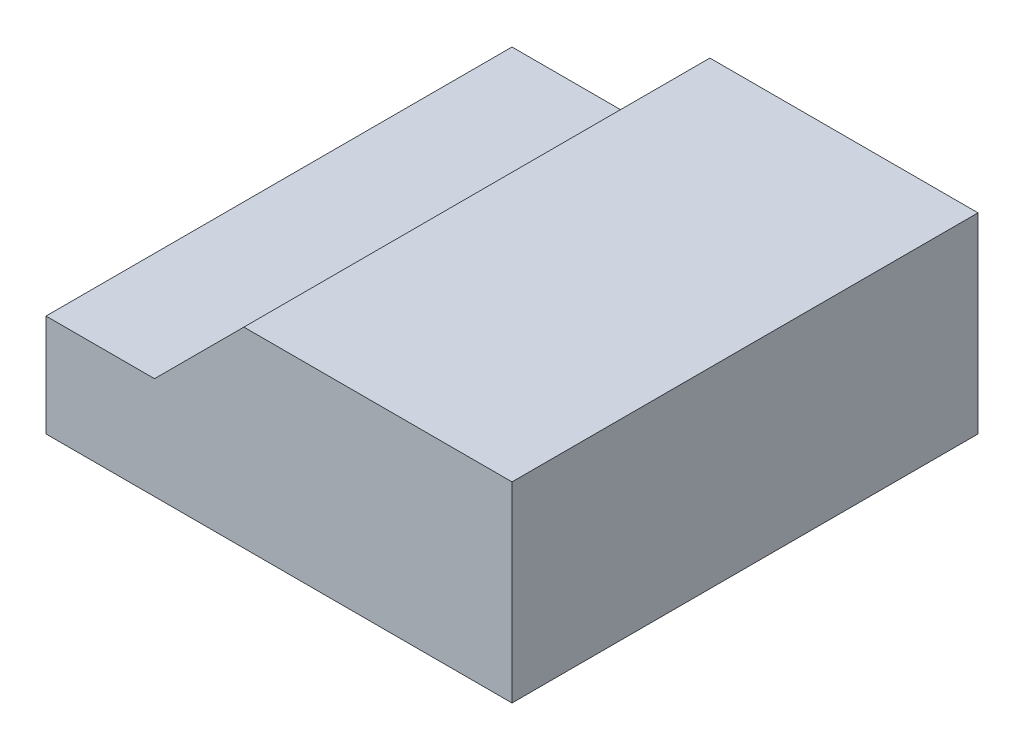
ISO-10303-21;
HEADER;
FILE_DESCRIPTION(('STEP AP214'),'2;1');
FILE_NAME('part.step','',(''),(''),'','','');
FILE_SCHEMA(('AUTOMOTIVE_DESIGN { 1 0 10303 214 1 1 1 1 }'));
ENDSEC;
DATA;
#1=APPLICATION_CONTEXT('core data for automotive mechanical design processes');
#2=APPLICATION_PROTOCOL_DEFINITION('international standard','automotive_design',2000,#1);
#3=PRODUCT_CONTEXT('',#1,'mechanical');
#4=PRODUCT('Part','Part','',(#3));
#5=PRODUCT_RELATED_PRODUCT_CATEGORY('part','',(#4));
#6=PRODUCT_DEFINITION_FORMATION('','',#4);
#7=PRODUCT_DEFINITION_CONTEXT('part definition',#1,'design');
#8=PRODUCT_DEFINITION('design','',#6,#7);
#9=PRODUCT_DEFINITION_SHAPE('','',#8);
#10=(LENGTH_UNIT() NAMED_UNIT(*) SI_UNIT(.MILLI.,.METRE.));
#11=(NAMED_UNIT(*) PLANE_ANGLE_UNIT() SI_UNIT($,.RADIAN.));
#12=(NAMED_UNIT(*) SI_UNIT($,.STERADIAN.) SOLID_ANGLE_UNIT());
#13=UNCERTAINTY_MEASURE_WITH_UNIT(LENGTH_MEASURE(1.E-05),#10,'distance_accuracy_value','');
#14=(GEOMETRIC_REPRESENTATION_CONTEXT(3) GLOBAL_UNCERTAINTY_ASSIGNED_CONTEXT((#13)) GLOBAL_UNIT_ASSIGNED_CONTEXT((#10,
#11,#12)) REPRESENTATION_CONTEXT('',''));
#15=CARTESIAN_POINT('',(0.,0.,0.));
#16=DIRECTION('',(0.,0.,1.));
#17=DIRECTION('',(1.,0.,0.));
#18=AXIS2_PLACEMENT_3D('',#15,#16,#17);
#19=CARTESIAN_POINT('',(-36.5,1.,36.5));
#20=DIRECTION('',(1.,0.,0.));
#21=DIRECTION('',(0.,0.,-1.));
#22=AXIS2_PLACEMENT_3D('',#19,#20,#21);
#23=PLANE('',#22);
#24=DIRECTION('',(0.,-1.,0.));
#25=VECTOR('',#24,1.);
#26=CARTESIAN_POINT('',(-36.5,1.,-36.5));
#27=LINE('',#26,#25);
#28=CARTESIAN_POINT('',(-36.5,1.,-36.5));
#29=VERTEX_POINT('',#28);
#30=CARTESIAN_POINT('',(-36.5,-15.,-36.5));
#31=VERTEX_POINT('',#30);
#32=EDGE_CURVE('E117',#29,#31,#27,.T.);
#33=ORIENTED_EDGE('',*,*,#32,.T.);
#34=DIRECTION('',(0.,0.,-1.));
#35=VECTOR('',#34,1.);
#36=CARTESIAN_POINT('',(-36.5,-15.,36.5));
#37=LINE('',#36,#35);
#38=CARTESIAN_POINT('',(-36.5,-15.,36.5));
#39=VERTEX_POINT('',#38);
#40=EDGE_CURVE('E11',#39,#31,#37,.T.);
#41=ORIENTED_EDGE('',*,*,#40,.F.);
#42=DIRECTION('',(0.,-1.,0.));
#43=VECTOR('',#42,1.);
#44=CARTESIAN_POINT('',(-36.5,1.,36.5));
#45=LINE('',#44,#43);
#46=CARTESIAN_POINT('',(-36.5,1.,36.5));
#47=VERTEX_POINT('',#46);
#48=EDGE_CURVE('E127',#47,#39,#45,.T.);
#49=ORIENTED_EDGE('',*,*,#48,.F.);
#50=DIRECTION('',(0.,0.,-1.));
#51=VECTOR('',#50,1.);
#52=CARTESIAN_POINT('',(-36.5,1.,36.5));
#53=LINE('',#52,#51);
#54=EDGE_CURVE('E113',#47,#29,#53,.T.);
#55=ORIENTED_EDGE('',*,*,#54,.T.);
#56=EDGE_LOOP('',(#33,#41,#49,#55));
#57=FACE_BOUND('',#56,.T.);
#58=ADVANCED_FACE('F33',(#57),#23,.F.);
#59=CARTESIAN_POINT('',(-36.5,-15.,36.5));
#60=DIRECTION('',(0.,1.,0.));
#61=DIRECTION('',(0.,0.,1.));
#62=AXIS2_PLACEMENT_3D('',#59,#60,#61);
#63=PLANE('',#62);
#64=DIRECTION('',(1.,0.,0.));
#65=VECTOR('',#64,1.);
#66=CARTESIAN_POINT('',(-36.5,-15.,-36.5));
#67=LINE('',#66,#65);
#68=CARTESIAN_POINT('',(36.5,-15.,-36.5));
#69=VERTEX_POINT('',#68);
#70=EDGE_CURVE('E120',#31,#69,#67,.T.);
#71=ORIENTED_EDGE('',*,*,#70,.T.);
#72=DIRECTION('',(0.,0.,-1.));
#73=VECTOR('',#72,1.);
#74=CARTESIAN_POINT('',(36.5,-15.,36.5));
#75=LINE('',#74,#73);
#76=CARTESIAN_POINT('',(36.5,-15.,36.5));
#77=VERTEX_POINT('',#76);
#78=EDGE_CURVE('E41',#77,#69,#75,.T.);
#79=ORIENTED_EDGE('',*,*,#78,.F.);
#80=DIRECTION('',(1.,0.,0.));
#81=VECTOR('',#80,1.);
#82=CARTESIAN_POINT('',(-36.5,-15.,36.5));
#83=LINE('',#82,#81);
#84=EDGE_CURVE('E86',#39,#77,#83,.T.);
#85=ORIENTED_EDGE('',*,*,#84,.F.);
#86=ORIENTED_EDGE('',*,*,#40,.T.);
#87=EDGE_LOOP('',(#71,#79,#85,#86));
#88=FACE_BOUND('',#87,.T.);
#89=ADVANCED_FACE('F151',(#88),#63,.F.);
#90=CARTESIAN_POINT('',(36.5,-15.,36.5));
#91=DIRECTION('',(-1.,0.,0.));
#92=DIRECTION('',(0.,0.,1.));
#93=AXIS2_PLACEMENT_3D('',#90,#91,#92);
#94=PLANE('',#93);
#95=DIRECTION('',(0.,1.,0.));
#96=VECTOR('',#95,1.);
#97=CARTESIAN_POINT('',(36.5,-15.,-36.5));
#98=LINE('',#97,#96);
#99=CARTESIAN_POINT('',(36.5,15.,-36.5));
#100=VERTEX_POINT('',#99);
#101=EDGE_CURVE('E122',#69,#100,#98,.T.);
#102=ORIENTED_EDGE('',*,*,#101,.T.);
#103=DIRECTION('',(0.,0.,-1.));
#104=VECTOR('',#103,1.);
#105=CARTESIAN_POINT('',(36.5,15.,36.5));
#106=LINE('',#105,#104);
#107=CARTESIAN_POINT('',(36.5,15.,36.5));
#108=VERTEX_POINT('',#107);
#109=EDGE_CURVE('E108',#108,#100,#106,.T.);
#110=ORIENTED_EDGE('',*,*,#109,.F.);
#111=DIRECTION('',(0.,1.,0.));
#112=VECTOR('',#111,1.);
#113=CARTESIAN_POINT('',(36.5,-15.,36.5));
#114=LINE('',#113,#112);
#115=EDGE_CURVE('E99',#77,#108,#114,.T.);
#116=ORIENTED_EDGE('',*,*,#115,.F.);
#117=ORIENTED_EDGE('',*,*,#78,.T.);
#118=EDGE_LOOP('',(#102,#110,#116,#117));
#119=FACE_BOUND('',#118,.T.);
#120=ADVANCED_FACE('F133',(#119),#94,.F.);
#121=CARTESIAN_POINT('',(36.5,15.,36.5));
#122=DIRECTION('',(0.,-1.,0.));
#123=DIRECTION('',(1.,0.,0.));
#124=AXIS2_PLACEMENT_3D('',#121,#122,#123);
#125=PLANE('',#124);
#126=DIRECTION('',(-1.,0.,0.));
#127=VECTOR('',#126,1.);
#128=CARTESIAN_POINT('',(36.5,15.,-36.5));
#129=LINE('',#128,#127);
#130=CARTESIAN_POINT('',(-5.50000000000007,15.,-36.5));
#131=VERTEX_POINT('',#130);
#132=EDGE_CURVE('E107',#100,#131,#129,.T.);
#133=ORIENTED_EDGE('',*,*,#132,.T.);
#134=DIRECTION('',(0.,0.,-1.));
#135=VECTOR('',#134,1.);
#136=CARTESIAN_POINT('',(-5.50000000000007,15.,36.5));
#137=LINE('',#136,#135);
#138=CARTESIAN_POINT('',(-5.50000000000007,15.,36.5));
#139=VERTEX_POINT('',#138);
#140=EDGE_CURVE('E104',#139,#131,#137,.T.);
#141=ORIENTED_EDGE('',*,*,#140,.F.);
#142=DIRECTION('',(-1.,0.,0.));
#143=VECTOR('',#142,1.);
#144=CARTESIAN_POINT('',(36.5,15.,36.5));
#145=LINE('',#144,#143);
#146=EDGE_CURVE('E93',#108,#139,#145,.T.);
#147=ORIENTED_EDGE('',*,*,#146,.F.);
#148=ORIENTED_EDGE('',*,*,#109,.T.);
#149=EDGE_LOOP('',(#133,#141,#147,#148));
#150=FACE_BOUND('',#149,.T.);
#151=ADVANCED_FACE('F105',(#150),#125,.F.);
#152=CARTESIAN_POINT('',(-5.50000000000007,15.,36.5));
#153=DIRECTION('',(0.707106781186549,-0.707106781186546,0.));
#154=DIRECTION('',(0.707106781186546,0.707106781186549,0.));
#155=AXIS2_PLACEMENT_3D('',#152,#153,#154);
#156=PLANE('',#155);
#157=DIRECTION('',(-0.707106781186546,-0.707106781186549,0.));
#158=VECTOR('',#157,1.);
#159=CARTESIAN_POINT('',(-5.50000000000007,15.,-36.5));
#160=LINE('',#159,#158);
#161=CARTESIAN_POINT('',(-19.5,1.,-36.5));
#162=VERTEX_POINT('',#161);
#163=EDGE_CURVE('E72',#131,#162,#160,.T.);
#164=ORIENTED_EDGE('',*,*,#163,.T.);
#165=DIRECTION('',(0.,0.,-1.));
#166=VECTOR('',#165,1.);
#167=CARTESIAN_POINT('',(-19.5,1.,36.5));
#168=LINE('',#167,#166);
#169=CARTESIAN_POINT('',(-19.5,1.,36.5));
#170=VERTEX_POINT('',#169);
#171=EDGE_CURVE('E109',#170,#162,#168,.T.);
#172=ORIENTED_EDGE('',*,*,#171,.F.);
#173=DIRECTION('',(-0.707106781186546,-0.707106781186549,0.));
#174=VECTOR('',#173,1.);
#175=CARTESIAN_POINT('',(-5.50000000000007,15.,36.5));
#176=LINE('',#175,#174);
#177=EDGE_CURVE('E97',#139,#170,#176,.T.);
#178=ORIENTED_EDGE('',*,*,#177,.F.);
#179=ORIENTED_EDGE('',*,*,#140,.T.);
#180=EDGE_LOOP('',(#164,#172,#178,#179));
#181=FACE_BOUND('',#180,.T.);
#182=ADVANCED_FACE('F111',(#181),#156,.F.);
#183=CARTESIAN_POINT('',(-19.5,1.,36.5));
#184=DIRECTION('',(0.,-1.,0.));
#185=DIRECTION('',(1.,0.,0.));
#186=AXIS2_PLACEMENT_3D('',#183,#184,#185);
#187=PLANE('',#186);
#188=DIRECTION('',(-1.,0.,0.));
#189=VECTOR('',#188,1.);
#190=CARTESIAN_POINT('',(-19.5,1.,-36.5));
#191=LINE('',#190,#189);
#192=EDGE_CURVE('E78',#162,#29,#191,.T.);
#193=ORIENTED_EDGE('',*,*,#192,.T.);
#194=ORIENTED_EDGE('',*,*,#54,.F.);
#195=DIRECTION('',(-1.,0.,0.));
#196=VECTOR('',#195,1.);
#197=CARTESIAN_POINT('',(-19.5,1.,36.5));
#198=LINE('',#197,#196);
#199=EDGE_CURVE('E49',#170,#47,#198,.T.);
#200=ORIENTED_EDGE('',*,*,#199,.F.);
#201=ORIENTED_EDGE('',*,*,#171,.T.);
#202=EDGE_LOOP('',(#193,#194,#200,#201));
#203=FACE_BOUND('',#202,.T.);
#204=ADVANCED_FACE('F140',(#203),#187,.F.);
#205=CARTESIAN_POINT('',(0.,0.,36.5));
#206=DIRECTION('',(0.,0.,1.));
#207=DIRECTION('',(1.,0.,0.));
#208=AXIS2_PLACEMENT_3D('',#205,#206,#207);
#209=PLANE('',#208);
#210=ORIENTED_EDGE('',*,*,#48,.T.);
#211=ORIENTED_EDGE('',*,*,#84,.T.);
#212=ORIENTED_EDGE('',*,*,#115,.T.);
#213=ORIENTED_EDGE('',*,*,#146,.T.);
#214=ORIENTED_EDGE('',*,*,#177,.T.);
#215=ORIENTED_EDGE('',*,*,#199,.T.);
#216=EDGE_LOOP('',(#210,#211,#212,#213,#214,#215));
#217=FACE_BOUND('',#216,.T.);
#218=ADVANCED_FACE('F95',(#217),#209,.T.);
#219=CARTESIAN_POINT('',(0.,0.,-36.5));
#220=DIRECTION('',(0.,0.,1.));
#221=DIRECTION('',(1.,0.,0.));
#222=AXIS2_PLACEMENT_3D('',#219,#220,#221);
#223=PLANE('',#222);
#224=ORIENTED_EDGE('',*,*,#32,.F.);
#225=ORIENTED_EDGE('',*,*,#192,.F.);
#226=ORIENTED_EDGE('',*,*,#163,.F.);
#227=ORIENTED_EDGE('',*,*,#132,.F.);
#228=ORIENTED_EDGE('',*,*,#101,.F.);
#229=ORIENTED_EDGE('',*,*,#70,.F.);
#230=EDGE_LOOP('',(#224,#225,#226,#227,#228,#229));
#231=FACE_BOUND('',#230,.T.);
#232=ADVANCED_FACE('F136',(#231),#223,.F.);
#233=CLOSED_SHELL('',(#58,#89,#120,#151,#182,#204,#218,#232));
#234=MANIFOLD_SOLID_BREP('B2',#233);
#235=ADVANCED_BREP_SHAPE_REPRESENTATION('',(#18,#234),#14);
#236=SHAPE_DEFINITION_REPRESENTATION(#9,#235);
ENDSEC;
END-ISO-10303-21;
